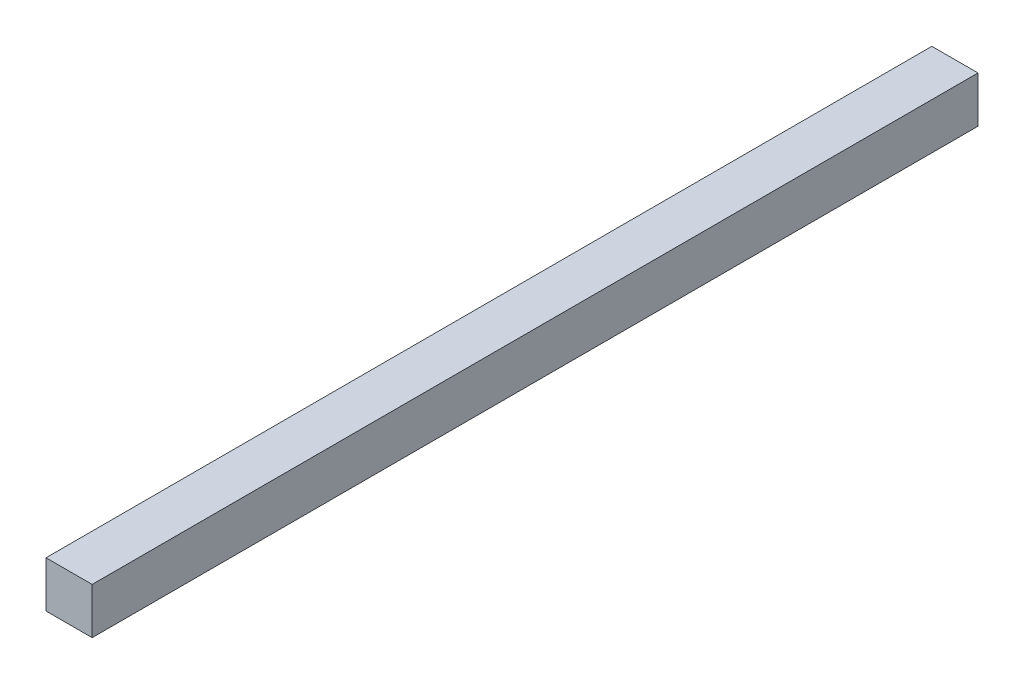
ISO-10303-21;
HEADER;
FILE_DESCRIPTION(('STEP AP214'),'2;1');
FILE_NAME('part.step','',(''),(''),'','','');
FILE_SCHEMA(('AUTOMOTIVE_DESIGN { 1 0 10303 214 1 1 1 1 }'));
ENDSEC;
DATA;
#1=APPLICATION_CONTEXT('core data for automotive mechanical design processes');
#2=APPLICATION_PROTOCOL_DEFINITION('international standard','automotive_design',2000,#1);
#3=PRODUCT_CONTEXT('',#1,'mechanical');
#4=PRODUCT('Part','Part','',(#3));
#5=PRODUCT_RELATED_PRODUCT_CATEGORY('part','',(#4));
#6=PRODUCT_DEFINITION_FORMATION('','',#4);
#7=PRODUCT_DEFINITION_CONTEXT('part definition',#1,'design');
#8=PRODUCT_DEFINITION('design','',#6,#7);
#9=PRODUCT_DEFINITION_SHAPE('','',#8);
#10=(LENGTH_UNIT() NAMED_UNIT(*) SI_UNIT(.MILLI.,.METRE.));
#11=(NAMED_UNIT(*) PLANE_ANGLE_UNIT() SI_UNIT($,.RADIAN.));
#12=(NAMED_UNIT(*) SI_UNIT($,.STERADIAN.) SOLID_ANGLE_UNIT());
#13=UNCERTAINTY_MEASURE_WITH_UNIT(LENGTH_MEASURE(1.E-05),#10,'distance_accuracy_value','');
#14=(GEOMETRIC_REPRESENTATION_CONTEXT(3) GLOBAL_UNCERTAINTY_ASSIGNED_CONTEXT((#13)) GLOBAL_UNIT_ASSIGNED_CONTEXT((#10,
#11,#12)) REPRESENTATION_CONTEXT('',''));
#15=CARTESIAN_POINT('',(0.,0.,0.));
#16=DIRECTION('',(0.,0.,1.));
#17=DIRECTION('',(1.,0.,0.));
#18=AXIS2_PLACEMENT_3D('',#15,#16,#17);
#19=CARTESIAN_POINT('',(31.75,31.75,0.));
#20=DIRECTION('',(0.,1.,0.));
#21=DIRECTION('',(0.,0.,1.));
#22=AXIS2_PLACEMENT_3D('',#19,#20,#21);
#23=PLANE('',#22);
#24=DIRECTION('',(1.,0.,0.));
#25=VECTOR('',#24,1.);
#26=CARTESIAN_POINT('',(0.,31.75,609.6));
#27=LINE('',#26,#25);
#28=CARTESIAN_POINT('',(31.75,31.75,609.6));
#29=VERTEX_POINT('',#28);
#30=CARTESIAN_POINT('',(0.,31.75,609.6));
#31=VERTEX_POINT('',#30);
#32=EDGE_CURVE('E84',#29,#31,#27,.F.);
#33=ORIENTED_EDGE('',*,*,#32,.F.);
#34=DIRECTION('',(0.,0.,-1.));
#35=VECTOR('',#34,1.);
#36=CARTESIAN_POINT('',(31.75,31.75,0.));
#37=LINE('',#36,#35);
#38=CARTESIAN_POINT('',(31.75,31.75,0.));
#39=VERTEX_POINT('',#38);
#40=EDGE_CURVE('E71',#39,#29,#37,.F.);
#41=ORIENTED_EDGE('',*,*,#40,.F.);
#42=DIRECTION('',(1.,0.,0.));
#43=VECTOR('',#42,1.);
#44=CARTESIAN_POINT('',(0.,31.75,0.));
#45=LINE('',#44,#43);
#46=CARTESIAN_POINT('',(0.,31.75,0.));
#47=VERTEX_POINT('',#46);
#48=EDGE_CURVE('E36',#39,#47,#45,.F.);
#49=ORIENTED_EDGE('',*,*,#48,.T.);
#50=DIRECTION('',(0.,0.,1.));
#51=VECTOR('',#50,1.);
#52=CARTESIAN_POINT('',(0.,31.75,0.));
#53=LINE('',#52,#51);
#54=EDGE_CURVE('E97',#31,#47,#53,.F.);
#55=ORIENTED_EDGE('',*,*,#54,.F.);
#56=EDGE_LOOP('',(#33,#41,#49,#55));
#57=FACE_BOUND('',#56,.T.);
#58=ADVANCED_FACE('F33',(#57),#23,.T.);
#59=CARTESIAN_POINT('',(0.,0.,0.));
#60=DIRECTION('',(0.,0.,1.));
#61=DIRECTION('',(1.,0.,0.));
#62=AXIS2_PLACEMENT_3D('',#59,#60,#61);
#63=PLANE('',#62);
#64=DIRECTION('',(0.,1.,0.));
#65=VECTOR('',#64,1.);
#66=CARTESIAN_POINT('',(0.,31.75,0.));
#67=LINE('',#66,#65);
#68=CARTESIAN_POINT('',(0.,0.,0.));
#69=VERTEX_POINT('',#68);
#70=EDGE_CURVE('E80',#47,#69,#67,.F.);
#71=ORIENTED_EDGE('',*,*,#70,.F.);
#72=ORIENTED_EDGE('',*,*,#48,.F.);
#73=DIRECTION('',(0.,1.,0.));
#74=VECTOR('',#73,1.);
#75=CARTESIAN_POINT('',(31.75,0.,0.));
#76=LINE('',#75,#74);
#77=CARTESIAN_POINT('',(31.75,0.,0.));
#78=VERTEX_POINT('',#77);
#79=EDGE_CURVE('E77',#78,#39,#76,.T.);
#80=ORIENTED_EDGE('',*,*,#79,.F.);
#81=DIRECTION('',(1.,0.,0.));
#82=VECTOR('',#81,1.);
#83=CARTESIAN_POINT('',(0.,0.,0.));
#84=LINE('',#83,#82);
#85=EDGE_CURVE('E99',#69,#78,#84,.T.);
#86=ORIENTED_EDGE('',*,*,#85,.F.);
#87=EDGE_LOOP('',(#71,#72,#80,#86));
#88=FACE_BOUND('',#87,.T.);
#89=ADVANCED_FACE('F76',(#88),#63,.F.);
#90=CARTESIAN_POINT('',(31.75,0.,0.));
#91=DIRECTION('',(1.,0.,0.));
#92=DIRECTION('',(0.,0.,-1.));
#93=AXIS2_PLACEMENT_3D('',#90,#91,#92);
#94=PLANE('',#93);
#95=DIRECTION('',(0.,1.,0.));
#96=VECTOR('',#95,1.);
#97=CARTESIAN_POINT('',(31.75,0.,609.6));
#98=LINE('',#97,#96);
#99=CARTESIAN_POINT('',(31.75,0.,609.6));
#100=VERTEX_POINT('',#99);
#101=EDGE_CURVE('E86',#100,#29,#98,.T.);
#102=ORIENTED_EDGE('',*,*,#101,.F.);
#103=DIRECTION('',(0.,0.,-1.));
#104=VECTOR('',#103,1.);
#105=CARTESIAN_POINT('',(31.75,0.,0.));
#106=LINE('',#105,#104);
#107=EDGE_CURVE('E90',#78,#100,#106,.F.);
#108=ORIENTED_EDGE('',*,*,#107,.F.);
#109=ORIENTED_EDGE('',*,*,#79,.T.);
#110=ORIENTED_EDGE('',*,*,#40,.T.);
#111=EDGE_LOOP('',(#102,#108,#109,#110));
#112=FACE_BOUND('',#111,.T.);
#113=ADVANCED_FACE('F88',(#112),#94,.T.);
#114=CARTESIAN_POINT('',(0.,0.,609.6));
#115=DIRECTION('',(0.,0.,1.));
#116=DIRECTION('',(1.,0.,0.));
#117=AXIS2_PLACEMENT_3D('',#114,#115,#116);
#118=PLANE('',#117);
#119=ORIENTED_EDGE('',*,*,#32,.T.);
#120=DIRECTION('',(0.,1.,0.));
#121=VECTOR('',#120,1.);
#122=CARTESIAN_POINT('',(0.,31.75,609.6));
#123=LINE('',#122,#121);
#124=CARTESIAN_POINT('',(0.,0.,609.6));
#125=VERTEX_POINT('',#124);
#126=EDGE_CURVE('E51',#125,#31,#123,.T.);
#127=ORIENTED_EDGE('',*,*,#126,.F.);
#128=DIRECTION('',(1.,0.,0.));
#129=VECTOR('',#128,1.);
#130=CARTESIAN_POINT('',(0.,0.,609.6));
#131=LINE('',#130,#129);
#132=EDGE_CURVE('E42',#100,#125,#131,.F.);
#133=ORIENTED_EDGE('',*,*,#132,.F.);
#134=ORIENTED_EDGE('',*,*,#101,.T.);
#135=EDGE_LOOP('',(#119,#127,#133,#134));
#136=FACE_BOUND('',#135,.T.);
#137=ADVANCED_FACE('F105',(#136),#118,.T.);
#138=CARTESIAN_POINT('',(0.,31.75,0.));
#139=DIRECTION('',(-1.,0.,0.));
#140=DIRECTION('',(0.,0.,1.));
#141=AXIS2_PLACEMENT_3D('',#138,#139,#140);
#142=PLANE('',#141);
#143=ORIENTED_EDGE('',*,*,#126,.T.);
#144=ORIENTED_EDGE('',*,*,#54,.T.);
#145=ORIENTED_EDGE('',*,*,#70,.T.);
#146=DIRECTION('',(0.,0.,-1.));
#147=VECTOR('',#146,1.);
#148=CARTESIAN_POINT('',(0.,0.,0.));
#149=LINE('',#148,#147);
#150=EDGE_CURVE('E11',#125,#69,#149,.T.);
#151=ORIENTED_EDGE('',*,*,#150,.F.);
#152=EDGE_LOOP('',(#143,#144,#145,#151));
#153=FACE_BOUND('',#152,.T.);
#154=ADVANCED_FACE('F107',(#153),#142,.T.);
#155=CARTESIAN_POINT('',(0.,0.,0.));
#156=DIRECTION('',(0.,-1.,0.));
#157=DIRECTION('',(0.,0.,-1.));
#158=AXIS2_PLACEMENT_3D('',#155,#156,#157);
#159=PLANE('',#158);
#160=ORIENTED_EDGE('',*,*,#132,.T.);
#161=ORIENTED_EDGE('',*,*,#150,.T.);
#162=ORIENTED_EDGE('',*,*,#85,.T.);
#163=ORIENTED_EDGE('',*,*,#107,.T.);
#164=EDGE_LOOP('',(#160,#161,#162,#163));
#165=FACE_BOUND('',#164,.T.);
#166=ADVANCED_FACE('F104',(#165),#159,.T.);
#167=CLOSED_SHELL('',(#58,#89,#113,#137,#154,#166));
#168=MANIFOLD_SOLID_BREP('B2',#167);
#169=ADVANCED_BREP_SHAPE_REPRESENTATION('',(#18,#168),#14);
#170=SHAPE_DEFINITION_REPRESENTATION(#9,#169);
ENDSEC;
END-ISO-10303-21;
